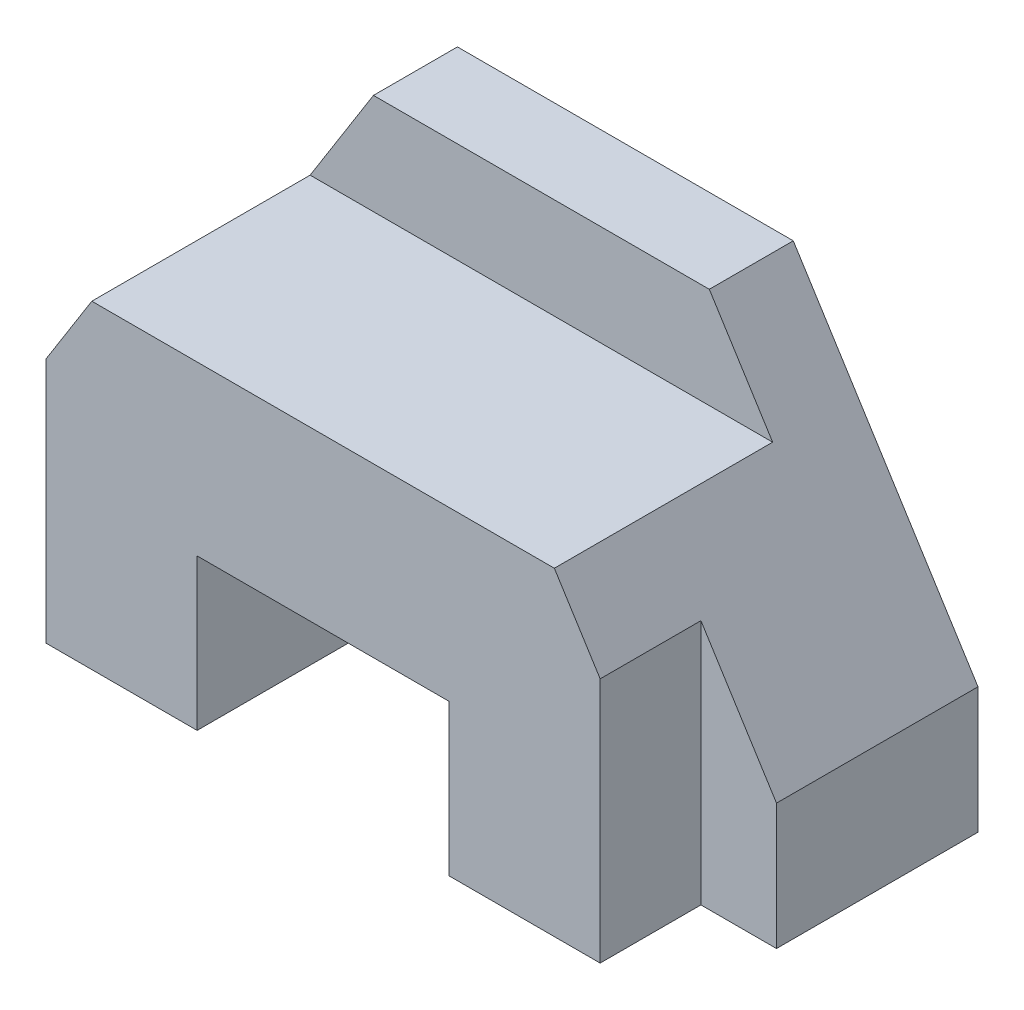
ISO-10303-21;
HEADER;
FILE_DESCRIPTION(('STEP AP214'),'2;1');
FILE_NAME('part.step','',(''),(''),'','','');
FILE_SCHEMA(('AUTOMOTIVE_DESIGN { 1 0 10303 214 1 1 1 1 }'));
ENDSEC;
DATA;
#1=APPLICATION_CONTEXT('core data for automotive mechanical design processes');
#2=APPLICATION_PROTOCOL_DEFINITION('international standard','automotive_design',2000,#1);
#3=PRODUCT_CONTEXT('',#1,'mechanical');
#4=PRODUCT('Part','Part','',(#3));
#5=PRODUCT_RELATED_PRODUCT_CATEGORY('part','',(#4));
#6=PRODUCT_DEFINITION_FORMATION('','',#4);
#7=PRODUCT_DEFINITION_CONTEXT('part definition',#1,'design');
#8=PRODUCT_DEFINITION('design','',#6,#7);
#9=PRODUCT_DEFINITION_SHAPE('','',#8);
#10=(LENGTH_UNIT() NAMED_UNIT(*) SI_UNIT(.MILLI.,.METRE.));
#11=(NAMED_UNIT(*) PLANE_ANGLE_UNIT() SI_UNIT($,.RADIAN.));
#12=(NAMED_UNIT(*) SI_UNIT($,.STERADIAN.) SOLID_ANGLE_UNIT());
#13=UNCERTAINTY_MEASURE_WITH_UNIT(LENGTH_MEASURE(1.E-05),#10,'distance_accuracy_value','');
#14=(GEOMETRIC_REPRESENTATION_CONTEXT(3) GLOBAL_UNCERTAINTY_ASSIGNED_CONTEXT((#13)) GLOBAL_UNIT_ASSIGNED_CONTEXT((#10,
#11,#12)) REPRESENTATION_CONTEXT('',''));
#15=CARTESIAN_POINT('',(0.,0.,0.));
#16=DIRECTION('',(0.,0.,1.));
#17=DIRECTION('',(1.,0.,0.));
#18=AXIS2_PLACEMENT_3D('',#15,#16,#17);
#19=CARTESIAN_POINT('',(42.,0.,18.));
#20=DIRECTION('',(0.,1.,0.));
#21=DIRECTION('',(0.,0.,1.));
#22=AXIS2_PLACEMENT_3D('',#19,#20,#21);
#23=PLANE('',#22);
#24=DIRECTION('',(1.,0.,0.));
#25=VECTOR('',#24,1.);
#26=CARTESIAN_POINT('',(42.,0.,-18.));
#27=LINE('',#26,#25);
#28=CARTESIAN_POINT('',(-42.,0.,-18.));
#29=VERTEX_POINT('',#28);
#30=CARTESIAN_POINT('',(-15.,0.,-18.));
#31=VERTEX_POINT('',#30);
#32=EDGE_CURVE('E164',#29,#31,#27,.T.);
#33=ORIENTED_EDGE('',*,*,#32,.T.);
#34=DIRECTION('',(0.,0.,1.));
#35=VECTOR('',#34,1.);
#36=CARTESIAN_POINT('',(-15.,0.,-18.));
#37=LINE('',#36,#35);
#38=CARTESIAN_POINT('',(-15.,0.,18.));
#39=VERTEX_POINT('',#38);
#40=EDGE_CURVE('E148',#31,#39,#37,.T.);
#41=ORIENTED_EDGE('',*,*,#40,.T.);
#42=DIRECTION('',(1.,0.,0.));
#43=VECTOR('',#42,1.);
#44=CARTESIAN_POINT('',(42.,0.,18.));
#45=LINE('',#44,#43);
#46=CARTESIAN_POINT('',(-33.,0.,18.));
#47=VERTEX_POINT('',#46);
#48=EDGE_CURVE('E185',#47,#39,#45,.T.);
#49=ORIENTED_EDGE('',*,*,#48,.F.);
#50=DIRECTION('',(0.,0.,1.));
#51=VECTOR('',#50,1.);
#52=CARTESIAN_POINT('',(-33.,0.,6.));
#53=LINE('',#52,#51);
#54=CARTESIAN_POINT('',(-33.,0.,6.));
#55=VERTEX_POINT('',#54);
#56=EDGE_CURVE('E59',#55,#47,#53,.T.);
#57=ORIENTED_EDGE('',*,*,#56,.F.);
#58=DIRECTION('',(1.,0.,0.));
#59=VECTOR('',#58,1.);
#60=CARTESIAN_POINT('',(-42.,0.,6.));
#61=LINE('',#60,#59);
#62=CARTESIAN_POINT('',(-42.,0.,6.));
#63=VERTEX_POINT('',#62);
#64=EDGE_CURVE('E248',#63,#55,#61,.T.);
#65=ORIENTED_EDGE('',*,*,#64,.F.);
#66=DIRECTION('',(0.,0.,-1.));
#67=VECTOR('',#66,1.);
#68=CARTESIAN_POINT('',(-42.,0.,18.));
#69=LINE('',#68,#67);
#70=EDGE_CURVE('E171',#63,#29,#69,.T.);
#71=ORIENTED_EDGE('',*,*,#70,.T.);
#72=EDGE_LOOP('',(#33,#41,#49,#57,#65,#71));
#73=FACE_BOUND('',#72,.T.);
#74=ADVANCED_FACE('F36',(#73),#23,.F.);
#75=CARTESIAN_POINT('',(-42.,0.,18.));
#76=DIRECTION('',(1.,0.,0.));
#77=DIRECTION('',(0.,1.,0.));
#78=AXIS2_PLACEMENT_3D('',#75,#76,#77);
#79=PLANE('',#78);
#80=DIRECTION('',(0.,-1.,0.));
#81=VECTOR('',#80,1.);
#82=CARTESIAN_POINT('',(-42.0000000000002,15.,6.));
#83=LINE('',#82,#81);
#84=CARTESIAN_POINT('',(-42.0000000000002,15.,6.));
#85=VERTEX_POINT('',#84);
#86=EDGE_CURVE('E242',#85,#63,#83,.T.);
#87=ORIENTED_EDGE('',*,*,#86,.F.);
#88=DIRECTION('',(0.,0.,-1.));
#89=VECTOR('',#88,1.);
#90=CARTESIAN_POINT('',(-42.0000000000002,15.,18.));
#91=LINE('',#90,#89);
#92=CARTESIAN_POINT('',(-42.0000000000002,15.,-18.));
#93=VERTEX_POINT('',#92);
#94=EDGE_CURVE('E187',#85,#93,#91,.T.);
#95=ORIENTED_EDGE('',*,*,#94,.T.);
#96=DIRECTION('',(0.,-1.,0.));
#97=VECTOR('',#96,1.);
#98=CARTESIAN_POINT('',(-42.,0.,-18.));
#99=LINE('',#98,#97);
#100=EDGE_CURVE('E178',#93,#29,#99,.T.);
#101=ORIENTED_EDGE('',*,*,#100,.T.);
#102=ORIENTED_EDGE('',*,*,#70,.F.);
#103=EDGE_LOOP('',(#87,#95,#101,#102));
#104=FACE_BOUND('',#103,.T.);
#105=ADVANCED_FACE('F314',(#104),#79,.F.);
#106=CARTESIAN_POINT('',(42.,0.,18.));
#107=DIRECTION('',(-1.,0.,0.));
#108=DIRECTION('',(0.,-1.,0.));
#109=AXIS2_PLACEMENT_3D('',#106,#107,#108);
#110=PLANE('',#109);
#111=DIRECTION('',(0.,0.,-1.));
#112=VECTOR('',#111,1.);
#113=CARTESIAN_POINT('',(42.0000000000002,15.,18.));
#114=LINE('',#113,#112);
#115=CARTESIAN_POINT('',(42.0000000000002,15.,6.));
#116=VERTEX_POINT('',#115);
#117=CARTESIAN_POINT('',(42.0000000000002,15.,-18.));
#118=VERTEX_POINT('',#117);
#119=EDGE_CURVE('E11',#116,#118,#114,.T.);
#120=ORIENTED_EDGE('',*,*,#119,.F.);
#121=DIRECTION('',(0.,1.,0.));
#122=VECTOR('',#121,1.);
#123=CARTESIAN_POINT('',(42.,0.,6.));
#124=LINE('',#123,#122);
#125=CARTESIAN_POINT('',(42.,0.,6.));
#126=VERTEX_POINT('',#125);
#127=EDGE_CURVE('E265',#126,#116,#124,.T.);
#128=ORIENTED_EDGE('',*,*,#127,.F.);
#129=DIRECTION('',(0.,0.,-1.));
#130=VECTOR('',#129,1.);
#131=CARTESIAN_POINT('',(42.,0.,18.));
#132=LINE('',#131,#130);
#133=CARTESIAN_POINT('',(42.,0.,-18.));
#134=VERTEX_POINT('',#133);
#135=EDGE_CURVE('E182',#126,#134,#132,.T.);
#136=ORIENTED_EDGE('',*,*,#135,.T.);
#137=DIRECTION('',(0.,1.,0.));
#138=VECTOR('',#137,1.);
#139=CARTESIAN_POINT('',(42.,0.,-18.));
#140=LINE('',#139,#138);
#141=EDGE_CURVE('E211',#134,#118,#140,.T.);
#142=ORIENTED_EDGE('',*,*,#141,.T.);
#143=EDGE_LOOP('',(#120,#128,#136,#142));
#144=FACE_BOUND('',#143,.T.);
#145=ADVANCED_FACE('F38',(#144),#110,.F.);
#146=CARTESIAN_POINT('',(42.0000000000002,15.,18.));
#147=DIRECTION('',(-0.846636549211003,-0.532171545218348,0.));
#148=DIRECTION('',(0.532171545218349,-0.846636549211003,0.));
#149=AXIS2_PLACEMENT_3D('',#146,#147,#148);
#150=PLANE('',#149);
#151=DIRECTION('',(-0.532171545218349,0.846636549211003,0.));
#152=VECTOR('',#151,1.);
#153=CARTESIAN_POINT('',(42.0000000000002,15.,18.));
#154=LINE('',#153,#152);
#155=CARTESIAN_POINT('',(33.,29.318181818182,18.));
#156=VERTEX_POINT('',#155);
#157=CARTESIAN_POINT('',(27.5428571428572,38.,18.));
#158=VERTEX_POINT('',#157);
#159=EDGE_CURVE('E173',#156,#158,#154,.T.);
#160=ORIENTED_EDGE('',*,*,#159,.F.);
#161=DIRECTION('',(0.,0.,1.));
#162=VECTOR('',#161,1.);
#163=CARTESIAN_POINT('',(33.,29.3181818181819,6.));
#164=LINE('',#163,#162);
#165=CARTESIAN_POINT('',(33.,29.3181818181819,6.));
#166=VERTEX_POINT('',#165);
#167=EDGE_CURVE('E258',#166,#156,#164,.T.);
#168=ORIENTED_EDGE('',*,*,#167,.F.);
#169=DIRECTION('',(-0.532171545218349,0.846636549211003,0.));
#170=VECTOR('',#169,1.);
#171=CARTESIAN_POINT('',(42.0000000000002,15.,6.));
#172=LINE('',#171,#170);
#173=EDGE_CURVE('E270',#116,#166,#172,.T.);
#174=ORIENTED_EDGE('',*,*,#173,.F.);
#175=ORIENTED_EDGE('',*,*,#119,.T.);
#176=DIRECTION('',(-0.532171545218349,0.846636549211003,0.));
#177=VECTOR('',#176,1.);
#178=CARTESIAN_POINT('',(42.0000000000002,15.,-18.));
#179=LINE('',#178,#177);
#180=CARTESIAN_POINT('',(20.,50.,-18.));
#181=VERTEX_POINT('',#180);
#182=EDGE_CURVE('E204',#118,#181,#179,.T.);
#183=ORIENTED_EDGE('',*,*,#182,.T.);
#184=DIRECTION('',(0.,0.,-1.));
#185=VECTOR('',#184,1.);
#186=CARTESIAN_POINT('',(20.,50.,18.));
#187=LINE('',#186,#185);
#188=CARTESIAN_POINT('',(20.,50.,-8.));
#189=VERTEX_POINT('',#188);
#190=EDGE_CURVE('E44',#189,#181,#187,.T.);
#191=ORIENTED_EDGE('',*,*,#190,.F.);
#192=DIRECTION('',(-0.532171545218348,0.846636549211003,0.));
#193=VECTOR('',#192,1.);
#194=CARTESIAN_POINT('',(27.5428571428572,38.,-8.));
#195=LINE('',#194,#193);
#196=CARTESIAN_POINT('',(27.5428571428572,38.,-8.));
#197=VERTEX_POINT('',#196);
#198=EDGE_CURVE('E233',#197,#189,#195,.T.);
#199=ORIENTED_EDGE('',*,*,#198,.F.);
#200=DIRECTION('',(0.,0.,1.));
#201=VECTOR('',#200,1.);
#202=CARTESIAN_POINT('',(27.5428571428572,38.,-8.));
#203=LINE('',#202,#201);
#204=EDGE_CURVE('E218',#197,#158,#203,.T.);
#205=ORIENTED_EDGE('',*,*,#204,.T.);
#206=EDGE_LOOP('',(#160,#168,#174,#175,#183,#191,#199,#205));
#207=FACE_BOUND('',#206,.T.);
#208=ADVANCED_FACE('F206',(#207),#150,.F.);
#209=CARTESIAN_POINT('',(-20.,50.,18.));
#210=DIRECTION('',(0.,-1.,0.));
#211=DIRECTION('',(0.,0.,-1.));
#212=AXIS2_PLACEMENT_3D('',#209,#210,#211);
#213=PLANE('',#212);
#214=DIRECTION('',(0.,0.,-1.));
#215=VECTOR('',#214,1.);
#216=CARTESIAN_POINT('',(-20.,50.,18.));
#217=LINE('',#216,#215);
#218=CARTESIAN_POINT('',(-20.,50.,-8.));
#219=VERTEX_POINT('',#218);
#220=CARTESIAN_POINT('',(-20.,50.,-18.));
#221=VERTEX_POINT('',#220);
#222=EDGE_CURVE('E189',#219,#221,#217,.T.);
#223=ORIENTED_EDGE('',*,*,#222,.F.);
#224=DIRECTION('',(-1.,0.,0.));
#225=VECTOR('',#224,1.);
#226=CARTESIAN_POINT('',(20.,50.,-8.));
#227=LINE('',#226,#225);
#228=EDGE_CURVE('E200',#189,#219,#227,.T.);
#229=ORIENTED_EDGE('',*,*,#228,.F.);
#230=ORIENTED_EDGE('',*,*,#190,.T.);
#231=DIRECTION('',(-1.,0.,0.));
#232=VECTOR('',#231,1.);
#233=CARTESIAN_POINT('',(-20.,50.,-18.));
#234=LINE('',#233,#232);
#235=EDGE_CURVE('E198',#181,#221,#234,.T.);
#236=ORIENTED_EDGE('',*,*,#235,.T.);
#237=EDGE_LOOP('',(#223,#229,#230,#236));
#238=FACE_BOUND('',#237,.T.);
#239=ADVANCED_FACE('F196',(#238),#213,.F.);
#240=CARTESIAN_POINT('',(-42.0000000000002,15.,18.));
#241=DIRECTION('',(0.846636549211003,-0.532171545218348,0.));
#242=DIRECTION('',(0.532171545218349,0.846636549211003,0.));
#243=AXIS2_PLACEMENT_3D('',#240,#241,#242);
#244=PLANE('',#243);
#245=DIRECTION('',(-0.532171545218349,-0.846636549211003,0.));
#246=VECTOR('',#245,1.);
#247=CARTESIAN_POINT('',(-33.,29.318181818182,6.));
#248=LINE('',#247,#246);
#249=CARTESIAN_POINT('',(-33.,29.318181818182,6.));
#250=VERTEX_POINT('',#249);
#251=EDGE_CURVE('E251',#250,#85,#248,.T.);
#252=ORIENTED_EDGE('',*,*,#251,.F.);
#253=DIRECTION('',(0.,0.,1.));
#254=VECTOR('',#253,1.);
#255=CARTESIAN_POINT('',(-33.,29.318181818182,6.));
#256=LINE('',#255,#254);
#257=CARTESIAN_POINT('',(-33.,29.318181818182,18.));
#258=VERTEX_POINT('',#257);
#259=EDGE_CURVE('E241',#250,#258,#256,.T.);
#260=ORIENTED_EDGE('',*,*,#259,.T.);
#261=DIRECTION('',(-0.532171545218349,-0.846636549211003,0.));
#262=VECTOR('',#261,1.);
#263=CARTESIAN_POINT('',(-42.0000000000002,15.,18.));
#264=LINE('',#263,#262);
#265=CARTESIAN_POINT('',(-27.5428571428572,38.,18.));
#266=VERTEX_POINT('',#265);
#267=EDGE_CURVE('E176',#266,#258,#264,.T.);
#268=ORIENTED_EDGE('',*,*,#267,.F.);
#269=DIRECTION('',(0.,0.,1.));
#270=VECTOR('',#269,1.);
#271=CARTESIAN_POINT('',(-27.5428571428572,38.,-8.));
#272=LINE('',#271,#270);
#273=CARTESIAN_POINT('',(-27.5428571428572,38.,-8.));
#274=VERTEX_POINT('',#273);
#275=EDGE_CURVE('E223',#274,#266,#272,.T.);
#276=ORIENTED_EDGE('',*,*,#275,.F.);
#277=DIRECTION('',(-0.532171545218349,-0.846636549211003,0.));
#278=VECTOR('',#277,1.);
#279=CARTESIAN_POINT('',(-20.,50.,-8.));
#280=LINE('',#279,#278);
#281=EDGE_CURVE('E230',#219,#274,#280,.T.);
#282=ORIENTED_EDGE('',*,*,#281,.F.);
#283=ORIENTED_EDGE('',*,*,#222,.T.);
#284=DIRECTION('',(-0.532171545218349,-0.846636549211003,0.));
#285=VECTOR('',#284,1.);
#286=CARTESIAN_POINT('',(-42.0000000000002,15.,-18.));
#287=LINE('',#286,#285);
#288=EDGE_CURVE('E214',#221,#93,#287,.T.);
#289=ORIENTED_EDGE('',*,*,#288,.T.);
#290=ORIENTED_EDGE('',*,*,#94,.F.);
#291=EDGE_LOOP('',(#252,#260,#268,#276,#282,#283,#289,#290));
#292=FACE_BOUND('',#291,.T.);
#293=ADVANCED_FACE('F310',(#292),#244,.F.);
#294=CARTESIAN_POINT('',(15.,0.,18.));
#295=VERTEX_POINT('',#294);
#296=CARTESIAN_POINT('',(33.,0.,18.));
#297=VERTEX_POINT('',#296);
#298=EDGE_CURVE('E220',#295,#297,#45,.T.);
#299=ORIENTED_EDGE('',*,*,#298,.F.);
#300=DIRECTION('',(0.,0.,1.));
#301=VECTOR('',#300,1.);
#302=CARTESIAN_POINT('',(15.,0.,-18.));
#303=LINE('',#302,#301);
#304=CARTESIAN_POINT('',(15.,0.,-18.));
#305=VERTEX_POINT('',#304);
#306=EDGE_CURVE('E158',#305,#295,#303,.T.);
#307=ORIENTED_EDGE('',*,*,#306,.F.);
#308=EDGE_CURVE('E174',#305,#134,#27,.T.);
#309=ORIENTED_EDGE('',*,*,#308,.T.);
#310=ORIENTED_EDGE('',*,*,#135,.F.);
#311=DIRECTION('',(1.,0.,0.));
#312=VECTOR('',#311,1.);
#313=CARTESIAN_POINT('',(33.,0.,6.));
#314=LINE('',#313,#312);
#315=CARTESIAN_POINT('',(33.,0.,6.));
#316=VERTEX_POINT('',#315);
#317=EDGE_CURVE('E260',#316,#126,#314,.T.);
#318=ORIENTED_EDGE('',*,*,#317,.F.);
#319=DIRECTION('',(0.,0.,1.));
#320=VECTOR('',#319,1.);
#321=CARTESIAN_POINT('',(33.,0.,6.));
#322=LINE('',#321,#320);
#323=EDGE_CURVE('E231',#316,#297,#322,.T.);
#324=ORIENTED_EDGE('',*,*,#323,.T.);
#325=EDGE_LOOP('',(#299,#307,#309,#310,#318,#324));
#326=FACE_BOUND('',#325,.T.);
#327=ADVANCED_FACE('F292',(#326),#23,.F.);
#328=CARTESIAN_POINT('',(0.,0.,18.));
#329=DIRECTION('',(0.,0.,-1.));
#330=DIRECTION('',(-1.,0.,0.));
#331=AXIS2_PLACEMENT_3D('',#328,#329,#330);
#332=PLANE('',#331);
#333=ORIENTED_EDGE('',*,*,#48,.T.);
#334=DIRECTION('',(0.,-1.,0.));
#335=VECTOR('',#334,1.);
#336=CARTESIAN_POINT('',(-15.,0.,18.));
#337=LINE('',#336,#335);
#338=CARTESIAN_POINT('',(-15.,18.,18.));
#339=VERTEX_POINT('',#338);
#340=EDGE_CURVE('E153',#339,#39,#337,.T.);
#341=ORIENTED_EDGE('',*,*,#340,.F.);
#342=DIRECTION('',(-1.,0.,0.));
#343=VECTOR('',#342,1.);
#344=CARTESIAN_POINT('',(-15.,18.,18.));
#345=LINE('',#344,#343);
#346=CARTESIAN_POINT('',(15.,18.,18.));
#347=VERTEX_POINT('',#346);
#348=EDGE_CURVE('E167',#347,#339,#345,.T.);
#349=ORIENTED_EDGE('',*,*,#348,.F.);
#350=DIRECTION('',(0.,1.,0.));
#351=VECTOR('',#350,1.);
#352=CARTESIAN_POINT('',(15.,0.,18.));
#353=LINE('',#352,#351);
#354=EDGE_CURVE('E280',#295,#347,#353,.T.);
#355=ORIENTED_EDGE('',*,*,#354,.F.);
#356=ORIENTED_EDGE('',*,*,#298,.T.);
#357=DIRECTION('',(0.,-1.,0.));
#358=VECTOR('',#357,1.);
#359=CARTESIAN_POINT('',(33.,29.3181818181819,18.));
#360=LINE('',#359,#358);
#361=EDGE_CURVE('E245',#156,#297,#360,.T.);
#362=ORIENTED_EDGE('',*,*,#361,.F.);
#363=ORIENTED_EDGE('',*,*,#159,.T.);
#364=DIRECTION('',(1.,0.,0.));
#365=VECTOR('',#364,1.);
#366=CARTESIAN_POINT('',(-27.5428571428572,38.,18.));
#367=LINE('',#366,#365);
#368=EDGE_CURVE('E227',#266,#158,#367,.T.);
#369=ORIENTED_EDGE('',*,*,#368,.F.);
#370=ORIENTED_EDGE('',*,*,#267,.T.);
#371=DIRECTION('',(0.,1.,0.));
#372=VECTOR('',#371,1.);
#373=CARTESIAN_POINT('',(-33.,0.,18.));
#374=LINE('',#373,#372);
#375=EDGE_CURVE('E246',#47,#258,#374,.T.);
#376=ORIENTED_EDGE('',*,*,#375,.F.);
#377=EDGE_LOOP('',(#333,#341,#349,#355,#356,#362,#363,#369,#370,#376));
#378=FACE_BOUND('',#377,.T.);
#379=ADVANCED_FACE('F297',(#378),#332,.F.);
#380=CARTESIAN_POINT('',(0.,0.,-18.));
#381=DIRECTION('',(0.,0.,-1.));
#382=DIRECTION('',(-1.,0.,0.));
#383=AXIS2_PLACEMENT_3D('',#380,#381,#382);
#384=PLANE('',#383);
#385=DIRECTION('',(0.,-1.,0.));
#386=VECTOR('',#385,1.);
#387=CARTESIAN_POINT('',(-15.,0.,-18.));
#388=LINE('',#387,#386);
#389=CARTESIAN_POINT('',(-15.,18.,-18.));
#390=VERTEX_POINT('',#389);
#391=EDGE_CURVE('E151',#390,#31,#388,.T.);
#392=ORIENTED_EDGE('',*,*,#391,.T.);
#393=ORIENTED_EDGE('',*,*,#32,.F.);
#394=ORIENTED_EDGE('',*,*,#100,.F.);
#395=ORIENTED_EDGE('',*,*,#288,.F.);
#396=ORIENTED_EDGE('',*,*,#235,.F.);
#397=ORIENTED_EDGE('',*,*,#182,.F.);
#398=ORIENTED_EDGE('',*,*,#141,.F.);
#399=ORIENTED_EDGE('',*,*,#308,.F.);
#400=DIRECTION('',(0.,1.,0.));
#401=VECTOR('',#400,1.);
#402=CARTESIAN_POINT('',(15.,0.,-18.));
#403=LINE('',#402,#401);
#404=CARTESIAN_POINT('',(15.,18.,-18.));
#405=VERTEX_POINT('',#404);
#406=EDGE_CURVE('E166',#305,#405,#403,.T.);
#407=ORIENTED_EDGE('',*,*,#406,.T.);
#408=DIRECTION('',(-1.,0.,0.));
#409=VECTOR('',#408,1.);
#410=CARTESIAN_POINT('',(-15.,18.,-18.));
#411=LINE('',#410,#409);
#412=EDGE_CURVE('E51',#405,#390,#411,.T.);
#413=ORIENTED_EDGE('',*,*,#412,.T.);
#414=EDGE_LOOP('',(#392,#393,#394,#395,#396,#397,#398,#399,#407,#413));
#415=FACE_BOUND('',#414,.T.);
#416=ADVANCED_FACE('F162',(#415),#384,.T.);
#417=CARTESIAN_POINT('',(-27.5428571428572,38.,-8.));
#418=DIRECTION('',(0.,-1.,0.));
#419=DIRECTION('',(0.,0.,-1.));
#420=AXIS2_PLACEMENT_3D('',#417,#418,#419);
#421=PLANE('',#420);
#422=ORIENTED_EDGE('',*,*,#368,.T.);
#423=ORIENTED_EDGE('',*,*,#204,.F.);
#424=DIRECTION('',(1.,0.,0.));
#425=VECTOR('',#424,1.);
#426=CARTESIAN_POINT('',(-27.5428571428572,38.,-8.));
#427=LINE('',#426,#425);
#428=EDGE_CURVE('E235',#274,#197,#427,.T.);
#429=ORIENTED_EDGE('',*,*,#428,.F.);
#430=ORIENTED_EDGE('',*,*,#275,.T.);
#431=EDGE_LOOP('',(#422,#423,#429,#430));
#432=FACE_BOUND('',#431,.T.);
#433=ADVANCED_FACE('F305',(#432),#421,.F.);
#434=CARTESIAN_POINT('',(0.,0.,-8.));
#435=DIRECTION('',(0.,0.,-1.));
#436=DIRECTION('',(-1.,0.,0.));
#437=AXIS2_PLACEMENT_3D('',#434,#435,#436);
#438=PLANE('',#437);
#439=ORIENTED_EDGE('',*,*,#281,.T.);
#440=ORIENTED_EDGE('',*,*,#428,.T.);
#441=ORIENTED_EDGE('',*,*,#198,.T.);
#442=ORIENTED_EDGE('',*,*,#228,.T.);
#443=EDGE_LOOP('',(#439,#440,#441,#442));
#444=FACE_BOUND('',#443,.T.);
#445=ADVANCED_FACE('F319',(#444),#438,.F.);
#446=CARTESIAN_POINT('',(-33.,0.,6.));
#447=DIRECTION('',(1.,0.,0.));
#448=DIRECTION('',(0.,0.,-1.));
#449=AXIS2_PLACEMENT_3D('',#446,#447,#448);
#450=PLANE('',#449);
#451=ORIENTED_EDGE('',*,*,#375,.T.);
#452=ORIENTED_EDGE('',*,*,#259,.F.);
#453=DIRECTION('',(0.,1.,0.));
#454=VECTOR('',#453,1.);
#455=CARTESIAN_POINT('',(-33.,0.,6.));
#456=LINE('',#455,#454);
#457=EDGE_CURVE('E253',#55,#250,#456,.T.);
#458=ORIENTED_EDGE('',*,*,#457,.F.);
#459=ORIENTED_EDGE('',*,*,#56,.T.);
#460=EDGE_LOOP('',(#451,#452,#458,#459));
#461=FACE_BOUND('',#460,.T.);
#462=ADVANCED_FACE('F317',(#461),#450,.F.);
#463=CARTESIAN_POINT('',(0.,0.,6.));
#464=DIRECTION('',(0.,0.,1.));
#465=DIRECTION('',(1.,0.,0.));
#466=AXIS2_PLACEMENT_3D('',#463,#464,#465);
#467=PLANE('',#466);
#468=ORIENTED_EDGE('',*,*,#64,.T.);
#469=ORIENTED_EDGE('',*,*,#457,.T.);
#470=ORIENTED_EDGE('',*,*,#251,.T.);
#471=ORIENTED_EDGE('',*,*,#86,.T.);
#472=EDGE_LOOP('',(#468,#469,#470,#471));
#473=FACE_BOUND('',#472,.T.);
#474=ADVANCED_FACE('F316',(#473),#467,.T.);
#475=CARTESIAN_POINT('',(33.,29.3181818181819,6.));
#476=DIRECTION('',(-1.,0.,0.));
#477=DIRECTION('',(0.,0.,1.));
#478=AXIS2_PLACEMENT_3D('',#475,#476,#477);
#479=PLANE('',#478);
#480=ORIENTED_EDGE('',*,*,#361,.T.);
#481=ORIENTED_EDGE('',*,*,#323,.F.);
#482=DIRECTION('',(0.,-1.,0.));
#483=VECTOR('',#482,1.);
#484=CARTESIAN_POINT('',(33.,29.3181818181819,6.));
#485=LINE('',#484,#483);
#486=EDGE_CURVE('E267',#166,#316,#485,.T.);
#487=ORIENTED_EDGE('',*,*,#486,.F.);
#488=ORIENTED_EDGE('',*,*,#167,.T.);
#489=EDGE_LOOP('',(#480,#481,#487,#488));
#490=FACE_BOUND('',#489,.T.);
#491=ADVANCED_FACE('F300',(#490),#479,.F.);
#492=CARTESIAN_POINT('',(0.,0.,6.));
#493=DIRECTION('',(0.,0.,-1.));
#494=DIRECTION('',(-1.,0.,0.));
#495=AXIS2_PLACEMENT_3D('',#492,#493,#494);
#496=PLANE('',#495);
#497=ORIENTED_EDGE('',*,*,#127,.T.);
#498=ORIENTED_EDGE('',*,*,#173,.T.);
#499=ORIENTED_EDGE('',*,*,#486,.T.);
#500=ORIENTED_EDGE('',*,*,#317,.T.);
#501=EDGE_LOOP('',(#497,#498,#499,#500));
#502=FACE_BOUND('',#501,.T.);
#503=ADVANCED_FACE('F355',(#502),#496,.F.);
#504=CARTESIAN_POINT('',(-15.,0.,-18.));
#505=DIRECTION('',(-1.,0.,0.));
#506=DIRECTION('',(0.,0.,1.));
#507=AXIS2_PLACEMENT_3D('',#504,#505,#506);
#508=PLANE('',#507);
#509=ORIENTED_EDGE('',*,*,#340,.T.);
#510=ORIENTED_EDGE('',*,*,#40,.F.);
#511=ORIENTED_EDGE('',*,*,#391,.F.);
#512=DIRECTION('',(0.,0.,1.));
#513=VECTOR('',#512,1.);
#514=CARTESIAN_POINT('',(-15.,18.,-18.));
#515=LINE('',#514,#513);
#516=EDGE_CURVE('E249',#390,#339,#515,.T.);
#517=ORIENTED_EDGE('',*,*,#516,.T.);
#518=EDGE_LOOP('',(#509,#510,#511,#517));
#519=FACE_BOUND('',#518,.T.);
#520=ADVANCED_FACE('F150',(#519),#508,.F.);
#521=CARTESIAN_POINT('',(-15.,18.,-18.));
#522=DIRECTION('',(0.,1.,0.));
#523=DIRECTION('',(0.,0.,1.));
#524=AXIS2_PLACEMENT_3D('',#521,#522,#523);
#525=PLANE('',#524);
#526=ORIENTED_EDGE('',*,*,#348,.T.);
#527=ORIENTED_EDGE('',*,*,#516,.F.);
#528=ORIENTED_EDGE('',*,*,#412,.F.);
#529=DIRECTION('',(0.,0.,1.));
#530=VECTOR('',#529,1.);
#531=CARTESIAN_POINT('',(15.,18.,-18.));
#532=LINE('',#531,#530);
#533=EDGE_CURVE('E275',#405,#347,#532,.T.);
#534=ORIENTED_EDGE('',*,*,#533,.T.);
#535=EDGE_LOOP('',(#526,#527,#528,#534));
#536=FACE_BOUND('',#535,.T.);
#537=ADVANCED_FACE('F362',(#536),#525,.F.);
#538=CARTESIAN_POINT('',(15.,0.,-18.));
#539=DIRECTION('',(1.,0.,0.));
#540=DIRECTION('',(0.,0.,-1.));
#541=AXIS2_PLACEMENT_3D('',#538,#539,#540);
#542=PLANE('',#541);
#543=ORIENTED_EDGE('',*,*,#354,.T.);
#544=ORIENTED_EDGE('',*,*,#533,.F.);
#545=ORIENTED_EDGE('',*,*,#406,.F.);
#546=ORIENTED_EDGE('',*,*,#306,.T.);
#547=EDGE_LOOP('',(#543,#544,#545,#546));
#548=FACE_BOUND('',#547,.T.);
#549=ADVANCED_FACE('F288',(#548),#542,.F.);
#550=CLOSED_SHELL('',(#74,#105,#145,#208,#239,#293,#327,#379,#416,#433,#445,#462,#474,#491,#503,
#520,#537,#549));
#551=MANIFOLD_SOLID_BREP('B2',#550);
#552=ADVANCED_BREP_SHAPE_REPRESENTATION('',(#18,#551),#14);
#553=SHAPE_DEFINITION_REPRESENTATION(#9,#552);
ENDSEC;
END-ISO-10303-21;
